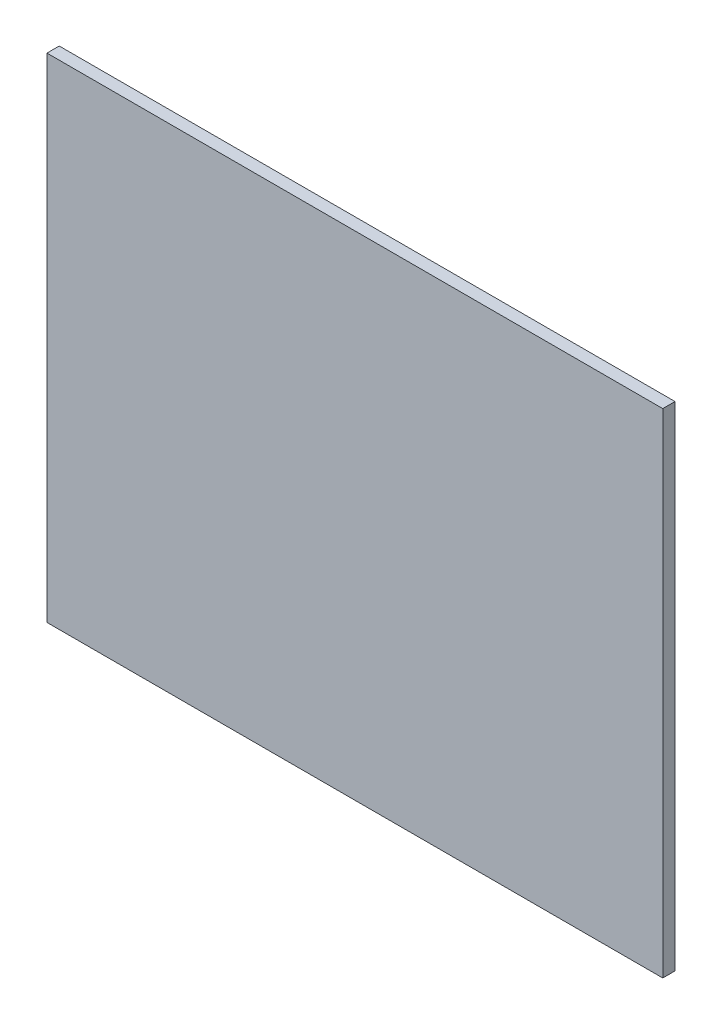
ISO-10303-21;
HEADER;
FILE_DESCRIPTION(('STEP AP214'),'2;1');
FILE_NAME('part.step','',(''),(''),'','','');
FILE_SCHEMA(('AUTOMOTIVE_DESIGN { 1 0 10303 214 1 1 1 1 }'));
ENDSEC;
DATA;
#1=APPLICATION_CONTEXT('core data for automotive mechanical design processes');
#2=APPLICATION_PROTOCOL_DEFINITION('international standard','automotive_design',2000,#1);
#3=PRODUCT_CONTEXT('',#1,'mechanical');
#4=PRODUCT('Part','Part','',(#3));
#5=PRODUCT_RELATED_PRODUCT_CATEGORY('part','',(#4));
#6=PRODUCT_DEFINITION_FORMATION('','',#4);
#7=PRODUCT_DEFINITION_CONTEXT('part definition',#1,'design');
#8=PRODUCT_DEFINITION('design','',#6,#7);
#9=PRODUCT_DEFINITION_SHAPE('','',#8);
#10=(LENGTH_UNIT() NAMED_UNIT(*) SI_UNIT(.MILLI.,.METRE.));
#11=(NAMED_UNIT(*) PLANE_ANGLE_UNIT() SI_UNIT($,.RADIAN.));
#12=(NAMED_UNIT(*) SI_UNIT($,.STERADIAN.) SOLID_ANGLE_UNIT());
#13=UNCERTAINTY_MEASURE_WITH_UNIT(LENGTH_MEASURE(1.E-05),#10,'distance_accuracy_value','');
#14=(GEOMETRIC_REPRESENTATION_CONTEXT(3) GLOBAL_UNCERTAINTY_ASSIGNED_CONTEXT((#13)) GLOBAL_UNIT_ASSIGNED_CONTEXT((#10,
#11,#12)) REPRESENTATION_CONTEXT('',''));
#15=CARTESIAN_POINT('',(0.,0.,0.));
#16=DIRECTION('',(0.,0.,1.));
#17=DIRECTION('',(1.,0.,0.));
#18=AXIS2_PLACEMENT_3D('',#15,#16,#17);
#19=CARTESIAN_POINT('',(0.,0.,5.));
#20=DIRECTION('',(1.,0.,0.));
#21=DIRECTION('',(0.,0.,-1.));
#22=AXIS2_PLACEMENT_3D('',#19,#20,#21);
#23=PLANE('',#22);
#24=DIRECTION('',(0.,-1.,0.));
#25=VECTOR('',#24,1.);
#26=CARTESIAN_POINT('',(0.,0.,0.));
#27=LINE('',#26,#25);
#28=CARTESIAN_POINT('',(0.,201.,0.));
#29=VERTEX_POINT('',#28);
#30=CARTESIAN_POINT('',(0.,0.,0.));
#31=VERTEX_POINT('',#30);
#32=EDGE_CURVE('E95',#29,#31,#27,.T.);
#33=ORIENTED_EDGE('',*,*,#32,.T.);
#34=DIRECTION('',(0.,0.,-1.));
#35=VECTOR('',#34,1.);
#36=CARTESIAN_POINT('',(0.,0.,5.));
#37=LINE('',#36,#35);
#38=CARTESIAN_POINT('',(0.,0.,5.));
#39=VERTEX_POINT('',#38);
#40=EDGE_CURVE('E11',#39,#31,#37,.T.);
#41=ORIENTED_EDGE('',*,*,#40,.F.);
#42=DIRECTION('',(0.,-1.,0.));
#43=VECTOR('',#42,1.);
#44=CARTESIAN_POINT('',(0.,0.,5.));
#45=LINE('',#44,#43);
#46=CARTESIAN_POINT('',(0.,201.,4.99999999999999));
#47=VERTEX_POINT('',#46);
#48=EDGE_CURVE('E83',#47,#39,#45,.T.);
#49=ORIENTED_EDGE('',*,*,#48,.F.);
#50=DIRECTION('',(0.,0.,-1.));
#51=VECTOR('',#50,1.);
#52=CARTESIAN_POINT('',(0.,201.,4.99999999999999));
#53=LINE('',#52,#51);
#54=EDGE_CURVE('E91',#47,#29,#53,.T.);
#55=ORIENTED_EDGE('',*,*,#54,.T.);
#56=EDGE_LOOP('',(#33,#41,#49,#55));
#57=FACE_BOUND('',#56,.T.);
#58=ADVANCED_FACE('F32',(#57),#23,.F.);
#59=CARTESIAN_POINT('',(0.,0.,5.));
#60=DIRECTION('',(0.,1.,0.));
#61=DIRECTION('',(0.,0.,1.));
#62=AXIS2_PLACEMENT_3D('',#59,#60,#61);
#63=PLANE('',#62);
#64=DIRECTION('',(1.,0.,0.));
#65=VECTOR('',#64,1.);
#66=CARTESIAN_POINT('',(0.,0.,0.));
#67=LINE('',#66,#65);
#68=CARTESIAN_POINT('',(251.,0.,0.));
#69=VERTEX_POINT('',#68);
#70=EDGE_CURVE('E87',#31,#69,#67,.T.);
#71=ORIENTED_EDGE('',*,*,#70,.T.);
#72=DIRECTION('',(0.,0.,-1.));
#73=VECTOR('',#72,1.);
#74=CARTESIAN_POINT('',(251.,0.,5.));
#75=LINE('',#74,#73);
#76=CARTESIAN_POINT('',(251.,0.,5.));
#77=VERTEX_POINT('',#76);
#78=EDGE_CURVE('E40',#77,#69,#75,.T.);
#79=ORIENTED_EDGE('',*,*,#78,.F.);
#80=DIRECTION('',(1.,0.,0.));
#81=VECTOR('',#80,1.);
#82=CARTESIAN_POINT('',(0.,0.,5.));
#83=LINE('',#82,#81);
#84=EDGE_CURVE('E78',#39,#77,#83,.T.);
#85=ORIENTED_EDGE('',*,*,#84,.F.);
#86=ORIENTED_EDGE('',*,*,#40,.T.);
#87=EDGE_LOOP('',(#71,#79,#85,#86));
#88=FACE_BOUND('',#87,.T.);
#89=ADVANCED_FACE('F86',(#88),#63,.F.);
#90=CARTESIAN_POINT('',(251.,0.,5.));
#91=DIRECTION('',(-1.,0.,0.));
#92=DIRECTION('',(0.,0.,1.));
#93=AXIS2_PLACEMENT_3D('',#90,#91,#92);
#94=PLANE('',#93);
#95=DIRECTION('',(0.,1.,0.));
#96=VECTOR('',#95,1.);
#97=CARTESIAN_POINT('',(251.,0.,0.));
#98=LINE('',#97,#96);
#99=CARTESIAN_POINT('',(251.,201.,0.));
#100=VERTEX_POINT('',#99);
#101=EDGE_CURVE('E65',#69,#100,#98,.T.);
#102=ORIENTED_EDGE('',*,*,#101,.T.);
#103=DIRECTION('',(0.,0.,-1.));
#104=VECTOR('',#103,1.);
#105=CARTESIAN_POINT('',(251.,201.,5.));
#106=LINE('',#105,#104);
#107=CARTESIAN_POINT('',(251.,201.,5.));
#108=VERTEX_POINT('',#107);
#109=EDGE_CURVE('E88',#108,#100,#106,.T.);
#110=ORIENTED_EDGE('',*,*,#109,.F.);
#111=DIRECTION('',(0.,1.,0.));
#112=VECTOR('',#111,1.);
#113=CARTESIAN_POINT('',(251.,0.,5.));
#114=LINE('',#113,#112);
#115=EDGE_CURVE('E81',#77,#108,#114,.T.);
#116=ORIENTED_EDGE('',*,*,#115,.F.);
#117=ORIENTED_EDGE('',*,*,#78,.T.);
#118=EDGE_LOOP('',(#102,#110,#116,#117));
#119=FACE_BOUND('',#118,.T.);
#120=ADVANCED_FACE('F89',(#119),#94,.F.);
#121=CARTESIAN_POINT('',(0.,201.,4.99999999999999));
#122=DIRECTION('',(0.,-1.,0.));
#123=DIRECTION('',(0.,0.,-1.));
#124=AXIS2_PLACEMENT_3D('',#121,#122,#123);
#125=PLANE('',#124);
#126=DIRECTION('',(-1.,0.,0.));
#127=VECTOR('',#126,1.);
#128=CARTESIAN_POINT('',(0.,201.,0.));
#129=LINE('',#128,#127);
#130=EDGE_CURVE('E71',#100,#29,#129,.T.);
#131=ORIENTED_EDGE('',*,*,#130,.T.);
#132=ORIENTED_EDGE('',*,*,#54,.F.);
#133=DIRECTION('',(-1.,0.,0.));
#134=VECTOR('',#133,1.);
#135=CARTESIAN_POINT('',(0.,201.,4.99999999999999));
#136=LINE('',#135,#134);
#137=EDGE_CURVE('E48',#108,#47,#136,.T.);
#138=ORIENTED_EDGE('',*,*,#137,.F.);
#139=ORIENTED_EDGE('',*,*,#109,.T.);
#140=EDGE_LOOP('',(#131,#132,#138,#139));
#141=FACE_BOUND('',#140,.T.);
#142=ADVANCED_FACE('F102',(#141),#125,.F.);
#143=CARTESIAN_POINT('',(0.,0.,5.));
#144=DIRECTION('',(0.,0.,-1.));
#145=DIRECTION('',(-1.,0.,0.));
#146=AXIS2_PLACEMENT_3D('',#143,#144,#145);
#147=PLANE('',#146);
#148=ORIENTED_EDGE('',*,*,#48,.T.);
#149=ORIENTED_EDGE('',*,*,#84,.T.);
#150=ORIENTED_EDGE('',*,*,#115,.T.);
#151=ORIENTED_EDGE('',*,*,#137,.T.);
#152=EDGE_LOOP('',(#148,#149,#150,#151));
#153=FACE_BOUND('',#152,.T.);
#154=ADVANCED_FACE('F79',(#153),#147,.F.);
#155=CARTESIAN_POINT('',(0.,0.,0.));
#156=DIRECTION('',(0.,0.,-1.));
#157=DIRECTION('',(-1.,0.,0.));
#158=AXIS2_PLACEMENT_3D('',#155,#156,#157);
#159=PLANE('',#158);
#160=ORIENTED_EDGE('',*,*,#32,.F.);
#161=ORIENTED_EDGE('',*,*,#130,.F.);
#162=ORIENTED_EDGE('',*,*,#101,.F.);
#163=ORIENTED_EDGE('',*,*,#70,.F.);
#164=EDGE_LOOP('',(#160,#161,#162,#163));
#165=FACE_BOUND('',#164,.T.);
#166=ADVANCED_FACE('F105',(#165),#159,.T.);
#167=CLOSED_SHELL('',(#58,#89,#120,#142,#154,#166));
#168=MANIFOLD_SOLID_BREP('B2',#167);
#169=ADVANCED_BREP_SHAPE_REPRESENTATION('',(#18,#168),#14);
#170=SHAPE_DEFINITION_REPRESENTATION(#9,#169);
ENDSEC;
END-ISO-10303-21;
